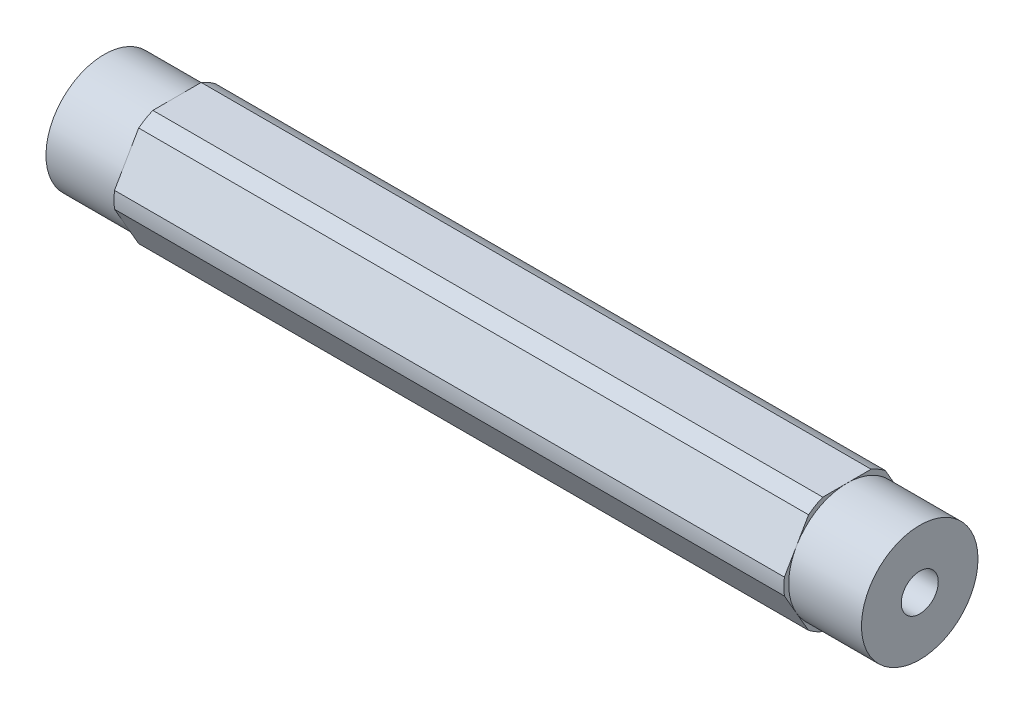
ISO-10303-21;
HEADER;
FILE_DESCRIPTION(('STEP AP214'),'2;1');
FILE_NAME('part.step','',(''),(''),'','','');
FILE_SCHEMA(('AUTOMOTIVE_DESIGN { 1 0 10303 214 1 1 1 1 }'));
ENDSEC;
DATA;
#1=APPLICATION_CONTEXT('core data for automotive mechanical design processes');
#2=APPLICATION_PROTOCOL_DEFINITION('international standard','automotive_design',2000,#1);
#3=PRODUCT_CONTEXT('',#1,'mechanical');
#4=PRODUCT('Part','Part','',(#3));
#5=PRODUCT_RELATED_PRODUCT_CATEGORY('part','',(#4));
#6=PRODUCT_DEFINITION_FORMATION('','',#4);
#7=PRODUCT_DEFINITION_CONTEXT('part definition',#1,'design');
#8=PRODUCT_DEFINITION('design','',#6,#7);
#9=PRODUCT_DEFINITION_SHAPE('','',#8);
#10=(LENGTH_UNIT() NAMED_UNIT(*) SI_UNIT(.MILLI.,.METRE.));
#11=(NAMED_UNIT(*) PLANE_ANGLE_UNIT() SI_UNIT($,.RADIAN.));
#12=(NAMED_UNIT(*) SI_UNIT($,.STERADIAN.) SOLID_ANGLE_UNIT());
#13=UNCERTAINTY_MEASURE_WITH_UNIT(LENGTH_MEASURE(1.E-05),#10,'distance_accuracy_value','');
#14=(GEOMETRIC_REPRESENTATION_CONTEXT(3) GLOBAL_UNCERTAINTY_ASSIGNED_CONTEXT((#13)) GLOBAL_UNIT_ASSIGNED_CONTEXT((#10,
#11,#12)) REPRESENTATION_CONTEXT('',''));
#15=CARTESIAN_POINT('',(0.,0.,0.));
#16=DIRECTION('',(0.,0.,1.));
#17=DIRECTION('',(1.,0.,0.));
#18=AXIS2_PLACEMENT_3D('',#15,#16,#17);
#19=CARTESIAN_POINT('',(-44.45,0.,0.));
#20=DIRECTION('',(1.,0.,0.));
#21=DIRECTION('',(0.,0.,-1.));
#22=AXIS2_PLACEMENT_3D('',#19,#20,#21);
#23=PLANE('',#22);
#24=CARTESIAN_POINT('',(-44.45,0.,0.));
#25=DIRECTION('',(1.,0.,0.));
#26=DIRECTION('',(0.,0.,-1.));
#27=AXIS2_PLACEMENT_3D('',#24,#25,#26);
#28=CIRCLE('',#27,2.0193);
#29=CARTESIAN_POINT('',(-44.45,0.,-2.0193));
#30=VERTEX_POINT('',#29);
#31=EDGE_CURVE('E249',#30,#30,#28,.T.);
#32=ORIENTED_EDGE('',*,*,#31,.T.);
#33=EDGE_LOOP('',(#32));
#34=FACE_BOUND('',#33,.T.);
#35=CARTESIAN_POINT('',(-44.45,0.,0.));
#36=DIRECTION('',(1.,0.,0.));
#37=DIRECTION('',(0.,0.,-1.));
#38=AXIS2_PLACEMENT_3D('',#35,#36,#37);
#39=CIRCLE('',#38,6.35);
#40=CARTESIAN_POINT('',(-44.45,0.,-6.35));
#41=VERTEX_POINT('',#40);
#42=EDGE_CURVE('E59',#41,#41,#39,.F.);
#43=ORIENTED_EDGE('',*,*,#42,.T.);
#44=EDGE_LOOP('',(#43));
#45=FACE_BOUND('',#44,.T.);
#46=ADVANCED_FACE('F51',(#34,#45),#23,.F.);
#47=CARTESIAN_POINT('',(44.45,3.17499999999999,-5.49926131403115));
#48=DIRECTION('',(0.,-0.500000000000001,0.866025403784438));
#49=DIRECTION('',(0.,-0.866025403784438,-0.500000000000001));
#50=AXIS2_PLACEMENT_3D('',#47,#48,#49);
#51=PLANE('',#50);
#52=DIRECTION('',(-1.,0.,0.));
#53=VECTOR('',#52,1.);
#54=CARTESIAN_POINT('',(44.45,0.893039571032097,-6.81675178197584));
#55=LINE('',#54,#53);
#56=CARTESIAN_POINT('',(36.5125,0.893039571032097,-6.81675178197584));
#57=VERTEX_POINT('',#56);
#58=CARTESIAN_POINT('',(-36.5125,0.893039571032097,-6.81675178197584));
#59=VERTEX_POINT('',#58);
#60=EDGE_CURVE('E208',#57,#59,#55,.T.);
#61=ORIENTED_EDGE('',*,*,#60,.T.);
#62=DIRECTION('',(0.,0.866025403784438,0.500000000000001));
#63=VECTOR('',#62,1.);
#64=CARTESIAN_POINT('',(-36.5125,3.17499999999999,-5.49926131403115));
#65=LINE('',#64,#63);
#66=CARTESIAN_POINT('',(-36.5125,3.17500000000001,-5.49926131403118));
#67=VERTEX_POINT('',#66);
#68=EDGE_CURVE('E66',#59,#67,#65,.T.);
#69=ORIENTED_EDGE('',*,*,#68,.T.);
#70=CARTESIAN_POINT('',(-36.5125,5.45696042896788,-4.18177084608646));
#71=VERTEX_POINT('',#70);
#72=EDGE_CURVE('E177',#67,#71,#65,.T.);
#73=ORIENTED_EDGE('',*,*,#72,.T.);
#74=DIRECTION('',(-1.,0.,0.));
#75=VECTOR('',#74,1.);
#76=CARTESIAN_POINT('',(44.45,5.45696042896788,-4.18177084608646));
#77=LINE('',#76,#75);
#78=CARTESIAN_POINT('',(36.5125,5.45696042896788,-4.18177084608646));
#79=VERTEX_POINT('',#78);
#80=EDGE_CURVE('E283',#79,#71,#77,.T.);
#81=ORIENTED_EDGE('',*,*,#80,.F.);
#82=DIRECTION('',(0.,0.866025403784438,0.500000000000001));
#83=VECTOR('',#82,1.);
#84=CARTESIAN_POINT('',(36.5125,3.17499999999999,-5.49926131403115));
#85=LINE('',#84,#83);
#86=CARTESIAN_POINT('',(36.5125,3.17500000000001,-5.49926131403118));
#87=VERTEX_POINT('',#86);
#88=EDGE_CURVE('E243',#87,#79,#85,.T.);
#89=ORIENTED_EDGE('',*,*,#88,.F.);
#90=EDGE_CURVE('E245',#57,#87,#85,.T.);
#91=ORIENTED_EDGE('',*,*,#90,.F.);
#92=EDGE_LOOP('',(#61,#69,#73,#81,#89,#91));
#93=FACE_BOUND('',#92,.T.);
#94=ADVANCED_FACE('F205',(#93),#51,.F.);
#95=CARTESIAN_POINT('',(44.45,0.,0.));
#96=DIRECTION('',(-1.,0.,0.));
#97=DIRECTION('',(0.,0.,1.));
#98=AXIS2_PLACEMENT_3D('',#95,#96,#97);
#99=CYLINDRICAL_SURFACE('',#98,6.874999966);
#100=ORIENTED_EDGE('',*,*,#80,.T.);
#101=CARTESIAN_POINT('',(-36.5125,0.,0.));
#102=DIRECTION('',(1.,0.,0.));
#103=DIRECTION('',(0.,0.,-1.));
#104=AXIS2_PLACEMENT_3D('',#101,#102,#103);
#105=CIRCLE('',#104,6.874999966);
#106=CARTESIAN_POINT('',(-36.5125,6.34999999999997,-2.63498093588935));
#107=VERTEX_POINT('',#106);
#108=EDGE_CURVE('E183',#71,#107,#105,.T.);
#109=ORIENTED_EDGE('',*,*,#108,.T.);
#110=DIRECTION('',(-1.,0.,0.));
#111=VECTOR('',#110,1.);
#112=CARTESIAN_POINT('',(44.45,6.34999999999997,-2.63498093588935));
#113=LINE('',#112,#111);
#114=CARTESIAN_POINT('',(36.5125,6.34999999999997,-2.63498093588935));
#115=VERTEX_POINT('',#114);
#116=EDGE_CURVE('E280',#115,#107,#113,.T.);
#117=ORIENTED_EDGE('',*,*,#116,.F.);
#118=CARTESIAN_POINT('',(36.5125,0.,0.));
#119=DIRECTION('',(1.,0.,0.));
#120=DIRECTION('',(0.,0.,-1.));
#121=AXIS2_PLACEMENT_3D('',#118,#119,#120);
#122=CIRCLE('',#121,6.874999966);
#123=EDGE_CURVE('E241',#79,#115,#122,.T.);
#124=ORIENTED_EDGE('',*,*,#123,.F.);
#125=EDGE_LOOP('',(#100,#109,#117,#124));
#126=FACE_BOUND('',#125,.T.);
#127=ADVANCED_FACE('F307',(#126),#99,.T.);
#128=CARTESIAN_POINT('',(44.45,6.34999999999997,0.));
#129=DIRECTION('',(0.,-1.,0.));
#130=DIRECTION('',(0.,0.,-1.));
#131=AXIS2_PLACEMENT_3D('',#128,#129,#130);
#132=PLANE('',#131);
#133=ORIENTED_EDGE('',*,*,#116,.T.);
#134=DIRECTION('',(0.,0.,1.));
#135=VECTOR('',#134,1.);
#136=CARTESIAN_POINT('',(-36.5125,6.34999999999997,0.));
#137=LINE('',#136,#135);
#138=CARTESIAN_POINT('',(-36.5125,6.35,0.));
#139=VERTEX_POINT('',#138);
#140=EDGE_CURVE('E346',#107,#139,#137,.T.);
#141=ORIENTED_EDGE('',*,*,#140,.T.);
#142=CARTESIAN_POINT('',(-36.5125,6.34999999999996,2.6349809358894));
#143=VERTEX_POINT('',#142);
#144=EDGE_CURVE('E349',#139,#143,#137,.T.);
#145=ORIENTED_EDGE('',*,*,#144,.T.);
#146=DIRECTION('',(-1.,0.,0.));
#147=VECTOR('',#146,1.);
#148=CARTESIAN_POINT('',(44.45,6.34999999999996,2.6349809358894));
#149=LINE('',#148,#147);
#150=CARTESIAN_POINT('',(36.5125,6.34999999999996,2.6349809358894));
#151=VERTEX_POINT('',#150);
#152=EDGE_CURVE('E277',#151,#143,#149,.T.);
#153=ORIENTED_EDGE('',*,*,#152,.F.);
#154=DIRECTION('',(0.,0.,1.));
#155=VECTOR('',#154,1.);
#156=CARTESIAN_POINT('',(36.5125,6.34999999999997,0.));
#157=LINE('',#156,#155);
#158=CARTESIAN_POINT('',(36.5125,6.35,0.));
#159=VERTEX_POINT('',#158);
#160=EDGE_CURVE('E238',#159,#151,#157,.T.);
#161=ORIENTED_EDGE('',*,*,#160,.F.);
#162=EDGE_CURVE('E240',#115,#159,#157,.T.);
#163=ORIENTED_EDGE('',*,*,#162,.F.);
#164=EDGE_LOOP('',(#133,#141,#145,#153,#161,#163));
#165=FACE_BOUND('',#164,.T.);
#166=ADVANCED_FACE('F314',(#165),#132,.F.);
#167=ORIENTED_EDGE('',*,*,#152,.T.);
#168=CARTESIAN_POINT('',(-36.5125,0.,0.));
#169=DIRECTION('',(1.,0.,0.));
#170=DIRECTION('',(0.,0.,-1.));
#171=AXIS2_PLACEMENT_3D('',#168,#169,#170);
#172=CIRCLE('',#171,6.874999966);
#173=CARTESIAN_POINT('',(-36.5125,5.45696042896785,4.1817708460865));
#174=VERTEX_POINT('',#173);
#175=EDGE_CURVE('E350',#143,#174,#172,.T.);
#176=ORIENTED_EDGE('',*,*,#175,.T.);
#177=DIRECTION('',(-1.,0.,0.));
#178=VECTOR('',#177,1.);
#179=CARTESIAN_POINT('',(44.45,5.45696042896785,4.1817708460865));
#180=LINE('',#179,#178);
#181=CARTESIAN_POINT('',(36.5125,5.45696042896785,4.1817708460865));
#182=VERTEX_POINT('',#181);
#183=EDGE_CURVE('E274',#182,#174,#180,.T.);
#184=ORIENTED_EDGE('',*,*,#183,.F.);
#185=CARTESIAN_POINT('',(36.5125,0.,0.));
#186=DIRECTION('',(1.,0.,0.));
#187=DIRECTION('',(0.,0.,-1.));
#188=AXIS2_PLACEMENT_3D('',#185,#186,#187);
#189=CIRCLE('',#188,6.874999966);
#190=EDGE_CURVE('E236',#151,#182,#189,.T.);
#191=ORIENTED_EDGE('',*,*,#190,.F.);
#192=EDGE_LOOP('',(#167,#176,#184,#191));
#193=FACE_BOUND('',#192,.T.);
#194=ADVANCED_FACE('F316',(#193),#99,.T.);
#195=CARTESIAN_POINT('',(44.45,3.17499999999995,5.49926131403117));
#196=DIRECTION('',(0.,-0.499999999999995,-0.866025403784441));
#197=DIRECTION('',(0.,0.866025403784442,-0.499999999999995));
#198=AXIS2_PLACEMENT_3D('',#195,#196,#197);
#199=PLANE('',#198);
#200=ORIENTED_EDGE('',*,*,#183,.T.);
#201=DIRECTION('',(0.,-0.866025403784442,0.499999999999995));
#202=VECTOR('',#201,1.);
#203=CARTESIAN_POINT('',(-36.5125,3.17499999999995,5.49926131403117));
#204=LINE('',#203,#202);
#205=CARTESIAN_POINT('',(-36.5125,3.17499999999997,5.4992613140312));
#206=VERTEX_POINT('',#205);
#207=EDGE_CURVE('E354',#174,#206,#204,.T.);
#208=ORIENTED_EDGE('',*,*,#207,.T.);
#209=CARTESIAN_POINT('',(-36.5125,0.893039571032046,6.81675178197585));
#210=VERTEX_POINT('',#209);
#211=EDGE_CURVE('E355',#206,#210,#204,.T.);
#212=ORIENTED_EDGE('',*,*,#211,.T.);
#213=DIRECTION('',(-1.,0.,0.));
#214=VECTOR('',#213,1.);
#215=CARTESIAN_POINT('',(44.45,0.893039571032046,6.81675178197585));
#216=LINE('',#215,#214);
#217=CARTESIAN_POINT('',(36.5125,0.893039571032046,6.81675178197585));
#218=VERTEX_POINT('',#217);
#219=EDGE_CURVE('E271',#218,#210,#216,.T.);
#220=ORIENTED_EDGE('',*,*,#219,.F.);
#221=DIRECTION('',(0.,-0.866025403784442,0.499999999999995));
#222=VECTOR('',#221,1.);
#223=CARTESIAN_POINT('',(36.5125,3.17499999999995,5.49926131403117));
#224=LINE('',#223,#222);
#225=CARTESIAN_POINT('',(36.5125,3.17499999999997,5.4992613140312));
#226=VERTEX_POINT('',#225);
#227=EDGE_CURVE('E233',#226,#218,#224,.T.);
#228=ORIENTED_EDGE('',*,*,#227,.F.);
#229=EDGE_CURVE('E235',#182,#226,#224,.T.);
#230=ORIENTED_EDGE('',*,*,#229,.F.);
#231=EDGE_LOOP('',(#200,#208,#212,#220,#228,#230));
#232=FACE_BOUND('',#231,.T.);
#233=ADVANCED_FACE('F333',(#232),#199,.F.);
#234=ORIENTED_EDGE('',*,*,#219,.T.);
#235=CARTESIAN_POINT('',(-36.5125,0.,0.));
#236=DIRECTION('',(1.,0.,0.));
#237=DIRECTION('',(0.,0.,-1.));
#238=AXIS2_PLACEMENT_3D('',#235,#236,#237);
#239=CIRCLE('',#238,6.874999966);
#240=CARTESIAN_POINT('',(-36.5125,-0.893039571032144,6.81675178197583));
#241=VERTEX_POINT('',#240);
#242=EDGE_CURVE('E358',#210,#241,#239,.T.);
#243=ORIENTED_EDGE('',*,*,#242,.T.);
#244=DIRECTION('',(-1.,0.,0.));
#245=VECTOR('',#244,1.);
#246=CARTESIAN_POINT('',(44.45,-0.893039571032144,6.81675178197584));
#247=LINE('',#246,#245);
#248=CARTESIAN_POINT('',(36.5125,-0.893039571032144,6.81675178197583));
#249=VERTEX_POINT('',#248);
#250=EDGE_CURVE('E268',#249,#241,#247,.T.);
#251=ORIENTED_EDGE('',*,*,#250,.F.);
#252=CARTESIAN_POINT('',(36.5125,0.,0.));
#253=DIRECTION('',(1.,0.,0.));
#254=DIRECTION('',(0.,0.,-1.));
#255=AXIS2_PLACEMENT_3D('',#252,#253,#254);
#256=CIRCLE('',#255,6.874999966);
#257=EDGE_CURVE('E231',#218,#249,#256,.T.);
#258=ORIENTED_EDGE('',*,*,#257,.F.);
#259=EDGE_LOOP('',(#234,#243,#251,#258));
#260=FACE_BOUND('',#259,.T.);
#261=ADVANCED_FACE('F331',(#260),#99,.T.);
#262=CARTESIAN_POINT('',(44.45,-3.17500000000003,5.49926131403113));
#263=DIRECTION('',(0.,0.500000000000007,-0.866025403784434));
#264=DIRECTION('',(0.,0.866025403784435,0.500000000000007));
#265=AXIS2_PLACEMENT_3D('',#262,#263,#264);
#266=PLANE('',#265);
#267=ORIENTED_EDGE('',*,*,#250,.T.);
#268=DIRECTION('',(0.,-0.866025403784435,-0.500000000000007));
#269=VECTOR('',#268,1.);
#270=CARTESIAN_POINT('',(-36.5125,-3.17500000000003,5.49926131403113));
#271=LINE('',#270,#269);
#272=CARTESIAN_POINT('',(-36.5125,-3.17500000000004,5.49926131403116));
#273=VERTEX_POINT('',#272);
#274=EDGE_CURVE('E361',#241,#273,#271,.T.);
#275=ORIENTED_EDGE('',*,*,#274,.T.);
#276=CARTESIAN_POINT('',(-36.5125,-5.45696042896791,4.18177084608642));
#277=VERTEX_POINT('',#276);
#278=EDGE_CURVE('E362',#273,#277,#271,.T.);
#279=ORIENTED_EDGE('',*,*,#278,.T.);
#280=DIRECTION('',(-1.,0.,0.));
#281=VECTOR('',#280,1.);
#282=CARTESIAN_POINT('',(44.45,-5.45696042896791,4.18177084608642));
#283=LINE('',#282,#281);
#284=CARTESIAN_POINT('',(36.5125,-5.45696042896791,4.18177084608642));
#285=VERTEX_POINT('',#284);
#286=EDGE_CURVE('E265',#285,#277,#283,.T.);
#287=ORIENTED_EDGE('',*,*,#286,.F.);
#288=DIRECTION('',(0.,-0.866025403784435,-0.500000000000007));
#289=VECTOR('',#288,1.);
#290=CARTESIAN_POINT('',(36.5125,-3.17500000000003,5.49926131403113));
#291=LINE('',#290,#289);
#292=CARTESIAN_POINT('',(36.5125,-3.17500000000004,5.49926131403116));
#293=VERTEX_POINT('',#292);
#294=EDGE_CURVE('E228',#293,#285,#291,.T.);
#295=ORIENTED_EDGE('',*,*,#294,.F.);
#296=EDGE_CURVE('E230',#249,#293,#291,.T.);
#297=ORIENTED_EDGE('',*,*,#296,.F.);
#298=EDGE_LOOP('',(#267,#275,#279,#287,#295,#297));
#299=FACE_BOUND('',#298,.T.);
#300=ADVANCED_FACE('F328',(#299),#266,.F.);
#301=ORIENTED_EDGE('',*,*,#286,.T.);
#302=CARTESIAN_POINT('',(-36.5125,0.,0.));
#303=DIRECTION('',(1.,0.,0.));
#304=DIRECTION('',(0.,0.,-1.));
#305=AXIS2_PLACEMENT_3D('',#302,#303,#304);
#306=CIRCLE('',#305,6.874999966);
#307=CARTESIAN_POINT('',(-36.5125,-6.34999999999999,2.63498093588931));
#308=VERTEX_POINT('',#307);
#309=EDGE_CURVE('E365',#277,#308,#306,.T.);
#310=ORIENTED_EDGE('',*,*,#309,.T.);
#311=DIRECTION('',(-1.,0.,0.));
#312=VECTOR('',#311,1.);
#313=CARTESIAN_POINT('',(44.45,-6.34999999999999,2.63498093588931));
#314=LINE('',#313,#312);
#315=CARTESIAN_POINT('',(36.5125,-6.34999999999999,2.63498093588931));
#316=VERTEX_POINT('',#315);
#317=EDGE_CURVE('E262',#316,#308,#314,.T.);
#318=ORIENTED_EDGE('',*,*,#317,.F.);
#319=CARTESIAN_POINT('',(36.5125,0.,0.));
#320=DIRECTION('',(1.,0.,0.));
#321=DIRECTION('',(0.,0.,-1.));
#322=AXIS2_PLACEMENT_3D('',#319,#320,#321);
#323=CIRCLE('',#322,6.874999966);
#324=EDGE_CURVE('E226',#285,#316,#323,.T.);
#325=ORIENTED_EDGE('',*,*,#324,.F.);
#326=EDGE_LOOP('',(#301,#310,#318,#325));
#327=FACE_BOUND('',#326,.T.);
#328=ADVANCED_FACE('F326',(#327),#99,.T.);
#329=CARTESIAN_POINT('',(44.45,-6.34999999999996,0.));
#330=DIRECTION('',(0.,1.,0.));
#331=DIRECTION('',(0.,0.,1.));
#332=AXIS2_PLACEMENT_3D('',#329,#330,#331);
#333=PLANE('',#332);
#334=ORIENTED_EDGE('',*,*,#317,.T.);
#335=DIRECTION('',(0.,0.,-1.));
#336=VECTOR('',#335,1.);
#337=CARTESIAN_POINT('',(-36.5125,-6.34999999999996,0.));
#338=LINE('',#337,#336);
#339=CARTESIAN_POINT('',(-36.5125,-6.35,0.));
#340=VERTEX_POINT('',#339);
#341=EDGE_CURVE('E368',#308,#340,#338,.T.);
#342=ORIENTED_EDGE('',*,*,#341,.T.);
#343=CARTESIAN_POINT('',(-36.5125,-6.34999999999994,-2.63498093588944));
#344=VERTEX_POINT('',#343);
#345=EDGE_CURVE('E369',#340,#344,#338,.T.);
#346=ORIENTED_EDGE('',*,*,#345,.T.);
#347=DIRECTION('',(-1.,0.,0.));
#348=VECTOR('',#347,1.);
#349=CARTESIAN_POINT('',(44.45,-6.34999999999994,-2.63498093588944));
#350=LINE('',#349,#348);
#351=CARTESIAN_POINT('',(36.5125,-6.34999999999994,-2.63498093588944));
#352=VERTEX_POINT('',#351);
#353=EDGE_CURVE('E259',#352,#344,#350,.T.);
#354=ORIENTED_EDGE('',*,*,#353,.F.);
#355=DIRECTION('',(0.,0.,-1.));
#356=VECTOR('',#355,1.);
#357=CARTESIAN_POINT('',(36.5125,-6.34999999999996,0.));
#358=LINE('',#357,#356);
#359=CARTESIAN_POINT('',(36.5125,-6.35,0.));
#360=VERTEX_POINT('',#359);
#361=EDGE_CURVE('E223',#360,#352,#358,.T.);
#362=ORIENTED_EDGE('',*,*,#361,.F.);
#363=EDGE_CURVE('E225',#316,#360,#358,.T.);
#364=ORIENTED_EDGE('',*,*,#363,.F.);
#365=EDGE_LOOP('',(#334,#342,#346,#354,#362,#364));
#366=FACE_BOUND('',#365,.T.);
#367=ADVANCED_FACE('F323',(#366),#333,.F.);
#368=ORIENTED_EDGE('',*,*,#353,.T.);
#369=CARTESIAN_POINT('',(-36.5125,0.,0.));
#370=DIRECTION('',(1.,0.,0.));
#371=DIRECTION('',(0.,0.,-1.));
#372=AXIS2_PLACEMENT_3D('',#369,#370,#371);
#373=CIRCLE('',#372,6.874999966);
#374=CARTESIAN_POINT('',(-36.5125,-5.45696042896781,-4.18177084608655));
#375=VERTEX_POINT('',#374);
#376=EDGE_CURVE('E372',#344,#375,#373,.T.);
#377=ORIENTED_EDGE('',*,*,#376,.T.);
#378=DIRECTION('',(-1.,0.,0.));
#379=VECTOR('',#378,1.);
#380=CARTESIAN_POINT('',(44.45,-5.45696042896782,-4.18177084608655));
#381=LINE('',#380,#379);
#382=CARTESIAN_POINT('',(36.5125,-5.45696042896781,-4.18177084608655));
#383=VERTEX_POINT('',#382);
#384=EDGE_CURVE('E256',#383,#375,#381,.T.);
#385=ORIENTED_EDGE('',*,*,#384,.F.);
#386=CARTESIAN_POINT('',(36.5125,0.,0.));
#387=DIRECTION('',(1.,0.,0.));
#388=DIRECTION('',(0.,0.,-1.));
#389=AXIS2_PLACEMENT_3D('',#386,#387,#388);
#390=CIRCLE('',#389,6.874999966);
#391=EDGE_CURVE('E221',#352,#383,#390,.T.);
#392=ORIENTED_EDGE('',*,*,#391,.F.);
#393=EDGE_LOOP('',(#368,#377,#385,#392));
#394=FACE_BOUND('',#393,.T.);
#395=ADVANCED_FACE('F321',(#394),#99,.T.);
#396=CARTESIAN_POINT('',(44.45,-3.17499999999996,-5.49926131403119));
#397=DIRECTION('',(0.,0.499999999999995,0.866025403784441));
#398=DIRECTION('',(0.,-0.866025403784441,0.499999999999995));
#399=AXIS2_PLACEMENT_3D('',#396,#397,#398);
#400=PLANE('',#399);
#401=ORIENTED_EDGE('',*,*,#384,.T.);
#402=DIRECTION('',(0.,0.866025403784441,-0.499999999999995));
#403=VECTOR('',#402,1.);
#404=CARTESIAN_POINT('',(-36.5125,-3.17499999999996,-5.49926131403119));
#405=LINE('',#404,#403);
#406=CARTESIAN_POINT('',(-36.5125,-3.17499999999997,-5.4992613140312));
#407=VERTEX_POINT('',#406);
#408=EDGE_CURVE('E375',#375,#407,#405,.T.);
#409=ORIENTED_EDGE('',*,*,#408,.T.);
#410=CARTESIAN_POINT('',(-36.5125,-0.893039571032112,-6.81675178197584));
#411=VERTEX_POINT('',#410);
#412=EDGE_CURVE('E192',#407,#411,#405,.T.);
#413=ORIENTED_EDGE('',*,*,#412,.T.);
#414=DIRECTION('',(-1.,0.,0.));
#415=VECTOR('',#414,1.);
#416=CARTESIAN_POINT('',(44.45,-0.893039571032111,-6.81675178197584));
#417=LINE('',#416,#415);
#418=CARTESIAN_POINT('',(36.5125,-0.893039571032111,-6.81675178197584));
#419=VERTEX_POINT('',#418);
#420=EDGE_CURVE('E253',#419,#411,#417,.T.);
#421=ORIENTED_EDGE('',*,*,#420,.F.);
#422=DIRECTION('',(0.,0.866025403784441,-0.499999999999995));
#423=VECTOR('',#422,1.);
#424=CARTESIAN_POINT('',(36.5125,-3.17499999999996,-5.49926131403119));
#425=LINE('',#424,#423);
#426=CARTESIAN_POINT('',(36.5125,-3.17499999999997,-5.4992613140312));
#427=VERTEX_POINT('',#426);
#428=EDGE_CURVE('E73',#427,#419,#425,.T.);
#429=ORIENTED_EDGE('',*,*,#428,.F.);
#430=EDGE_CURVE('E220',#383,#427,#425,.T.);
#431=ORIENTED_EDGE('',*,*,#430,.F.);
#432=EDGE_LOOP('',(#401,#409,#413,#421,#429,#431));
#433=FACE_BOUND('',#432,.T.);
#434=ADVANCED_FACE('F318',(#433),#400,.F.);
#435=ORIENTED_EDGE('',*,*,#420,.T.);
#436=CARTESIAN_POINT('',(-36.5125,0.,0.));
#437=DIRECTION('',(1.,0.,0.));
#438=DIRECTION('',(0.,0.,-1.));
#439=AXIS2_PLACEMENT_3D('',#436,#437,#438);
#440=CIRCLE('',#439,6.874999966);
#441=EDGE_CURVE('E12',#411,#59,#440,.T.);
#442=ORIENTED_EDGE('',*,*,#441,.T.);
#443=ORIENTED_EDGE('',*,*,#60,.F.);
#444=CARTESIAN_POINT('',(36.5125,0.,0.));
#445=DIRECTION('',(1.,0.,0.));
#446=DIRECTION('',(0.,0.,-1.));
#447=AXIS2_PLACEMENT_3D('',#444,#445,#446);
#448=CIRCLE('',#447,6.874999966);
#449=EDGE_CURVE('E288',#419,#57,#448,.T.);
#450=ORIENTED_EDGE('',*,*,#449,.F.);
#451=EDGE_LOOP('',(#435,#442,#443,#450));
#452=FACE_BOUND('',#451,.T.);
#453=ADVANCED_FACE('F317',(#452),#99,.T.);
#454=CARTESIAN_POINT('',(44.45,0.,0.));
#455=DIRECTION('',(1.,0.,0.));
#456=DIRECTION('',(0.,0.,-1.));
#457=AXIS2_PLACEMENT_3D('',#454,#455,#456);
#458=PLANE('',#457);
#459=CARTESIAN_POINT('',(44.45,0.,0.));
#460=DIRECTION('',(1.,0.,0.));
#461=DIRECTION('',(0.,0.,-1.));
#462=AXIS2_PLACEMENT_3D('',#459,#460,#461);
#463=CIRCLE('',#462,2.0193);
#464=CARTESIAN_POINT('',(44.45,0.,-2.0193));
#465=VERTEX_POINT('',#464);
#466=EDGE_CURVE('E246',#465,#465,#463,.T.);
#467=ORIENTED_EDGE('',*,*,#466,.F.);
#468=EDGE_LOOP('',(#467));
#469=FACE_BOUND('',#468,.T.);
#470=CARTESIAN_POINT('',(44.45,0.,0.));
#471=DIRECTION('',(1.,0.,0.));
#472=DIRECTION('',(0.,0.,-1.));
#473=AXIS2_PLACEMENT_3D('',#470,#471,#472);
#474=CIRCLE('',#473,6.35);
#475=CARTESIAN_POINT('',(44.45,0.,-6.35));
#476=VERTEX_POINT('',#475);
#477=EDGE_CURVE('E285',#476,#476,#474,.T.);
#478=ORIENTED_EDGE('',*,*,#477,.T.);
#479=EDGE_LOOP('',(#478));
#480=FACE_BOUND('',#479,.T.);
#481=ADVANCED_FACE('F310',(#469,#480),#458,.T.);
#482=CARTESIAN_POINT('',(44.45,0.,0.));
#483=DIRECTION('',(-1.,0.,0.));
#484=DIRECTION('',(0.,0.,1.));
#485=AXIS2_PLACEMENT_3D('',#482,#483,#484);
#486=CYLINDRICAL_SURFACE('',#485,2.0193);
#487=ORIENTED_EDGE('',*,*,#466,.T.);
#488=EDGE_LOOP('',(#487));
#489=FACE_BOUND('',#488,.T.);
#490=ORIENTED_EDGE('',*,*,#31,.F.);
#491=EDGE_LOOP('',(#490));
#492=FACE_BOUND('',#491,.T.);
#493=ADVANCED_FACE('F53',(#489,#492),#486,.F.);
#494=CARTESIAN_POINT('',(36.5125,0.,0.));
#495=DIRECTION('',(1.,0.,0.));
#496=DIRECTION('',(0.,0.,-1.));
#497=AXIS2_PLACEMENT_3D('',#494,#495,#496);
#498=PLANE('',#497);
#499=ORIENTED_EDGE('',*,*,#90,.T.);
#500=CARTESIAN_POINT('',(36.5125,0.,0.));
#501=DIRECTION('',(1.,0.,0.));
#502=DIRECTION('',(0.,0.,-1.));
#503=AXIS2_PLACEMENT_3D('',#500,#501,#502);
#504=CIRCLE('',#503,6.35);
#505=EDGE_CURVE('E209',#427,#87,#504,.T.);
#506=ORIENTED_EDGE('',*,*,#505,.F.);
#507=ORIENTED_EDGE('',*,*,#428,.T.);
#508=ORIENTED_EDGE('',*,*,#449,.T.);
#509=EDGE_LOOP('',(#499,#506,#507,#508));
#510=FACE_BOUND('',#509,.T.);
#511=ADVANCED_FACE('F422',(#510),#498,.T.);
#512=ORIENTED_EDGE('',*,*,#88,.T.);
#513=ORIENTED_EDGE('',*,*,#123,.T.);
#514=ORIENTED_EDGE('',*,*,#162,.T.);
#515=EDGE_CURVE('E213',#87,#159,#504,.T.);
#516=ORIENTED_EDGE('',*,*,#515,.F.);
#517=EDGE_LOOP('',(#512,#513,#514,#516));
#518=FACE_BOUND('',#517,.T.);
#519=ADVANCED_FACE('F416',(#518),#498,.T.);
#520=ORIENTED_EDGE('',*,*,#160,.T.);
#521=ORIENTED_EDGE('',*,*,#190,.T.);
#522=ORIENTED_EDGE('',*,*,#229,.T.);
#523=EDGE_CURVE('E218',#159,#226,#504,.T.);
#524=ORIENTED_EDGE('',*,*,#523,.F.);
#525=EDGE_LOOP('',(#520,#521,#522,#524));
#526=FACE_BOUND('',#525,.T.);
#527=ADVANCED_FACE('F405',(#526),#498,.T.);
#528=ORIENTED_EDGE('',*,*,#227,.T.);
#529=ORIENTED_EDGE('',*,*,#257,.T.);
#530=ORIENTED_EDGE('',*,*,#296,.T.);
#531=EDGE_CURVE('E410',#226,#293,#504,.T.);
#532=ORIENTED_EDGE('',*,*,#531,.F.);
#533=EDGE_LOOP('',(#528,#529,#530,#532));
#534=FACE_BOUND('',#533,.T.);
#535=ADVANCED_FACE('F438',(#534),#498,.T.);
#536=ORIENTED_EDGE('',*,*,#294,.T.);
#537=ORIENTED_EDGE('',*,*,#324,.T.);
#538=ORIENTED_EDGE('',*,*,#363,.T.);
#539=EDGE_CURVE('E424',#293,#360,#504,.T.);
#540=ORIENTED_EDGE('',*,*,#539,.F.);
#541=EDGE_LOOP('',(#536,#537,#538,#540));
#542=FACE_BOUND('',#541,.T.);
#543=ADVANCED_FACE('F432',(#542),#498,.T.);
#544=ORIENTED_EDGE('',*,*,#361,.T.);
#545=ORIENTED_EDGE('',*,*,#391,.T.);
#546=ORIENTED_EDGE('',*,*,#430,.T.);
#547=EDGE_CURVE('E211',#360,#427,#504,.T.);
#548=ORIENTED_EDGE('',*,*,#547,.F.);
#549=EDGE_LOOP('',(#544,#545,#546,#548));
#550=FACE_BOUND('',#549,.T.);
#551=ADVANCED_FACE('F420',(#550),#498,.T.);
#552=CARTESIAN_POINT('',(36.5125,0.,0.));
#553=DIRECTION('',(1.,0.,0.));
#554=DIRECTION('',(0.,0.,-1.));
#555=AXIS2_PLACEMENT_3D('',#552,#553,#554);
#556=CYLINDRICAL_SURFACE('',#555,6.35);
#557=ORIENTED_EDGE('',*,*,#477,.F.);
#558=EDGE_LOOP('',(#557));
#559=FACE_BOUND('',#558,.T.);
#560=ORIENTED_EDGE('',*,*,#505,.T.);
#561=ORIENTED_EDGE('',*,*,#515,.T.);
#562=ORIENTED_EDGE('',*,*,#523,.T.);
#563=ORIENTED_EDGE('',*,*,#531,.T.);
#564=ORIENTED_EDGE('',*,*,#539,.T.);
#565=ORIENTED_EDGE('',*,*,#547,.T.);
#566=EDGE_LOOP('',(#560,#561,#562,#563,#564,#565));
#567=FACE_BOUND('',#566,.T.);
#568=ADVANCED_FACE('F412',(#559,#567),#556,.T.);
#569=CARTESIAN_POINT('',(-36.5125,0.,0.));
#570=DIRECTION('',(1.,0.,0.));
#571=DIRECTION('',(0.,0.,-1.));
#572=AXIS2_PLACEMENT_3D('',#569,#570,#571);
#573=PLANE('',#572);
#574=ORIENTED_EDGE('',*,*,#441,.F.);
#575=ORIENTED_EDGE('',*,*,#412,.F.);
#576=CARTESIAN_POINT('',(-36.5125,0.,0.));
#577=DIRECTION('',(1.,0.,0.));
#578=DIRECTION('',(0.,0.,-1.));
#579=AXIS2_PLACEMENT_3D('',#576,#577,#578);
#580=CIRCLE('',#579,6.35);
#581=EDGE_CURVE('E189',#407,#67,#580,.T.);
#582=ORIENTED_EDGE('',*,*,#581,.T.);
#583=ORIENTED_EDGE('',*,*,#68,.F.);
#584=EDGE_LOOP('',(#574,#575,#582,#583));
#585=FACE_BOUND('',#584,.T.);
#586=ADVANCED_FACE('F190',(#585),#573,.F.);
#587=EDGE_CURVE('E180',#67,#139,#580,.T.);
#588=ORIENTED_EDGE('',*,*,#587,.T.);
#589=ORIENTED_EDGE('',*,*,#140,.F.);
#590=ORIENTED_EDGE('',*,*,#108,.F.);
#591=ORIENTED_EDGE('',*,*,#72,.F.);
#592=EDGE_LOOP('',(#588,#589,#590,#591));
#593=FACE_BOUND('',#592,.T.);
#594=ADVANCED_FACE('F178',(#593),#573,.F.);
#595=EDGE_CURVE('E203',#139,#206,#580,.T.);
#596=ORIENTED_EDGE('',*,*,#595,.T.);
#597=ORIENTED_EDGE('',*,*,#207,.F.);
#598=ORIENTED_EDGE('',*,*,#175,.F.);
#599=ORIENTED_EDGE('',*,*,#144,.F.);
#600=EDGE_LOOP('',(#596,#597,#598,#599));
#601=FACE_BOUND('',#600,.T.);
#602=ADVANCED_FACE('F396',(#601),#573,.F.);
#603=EDGE_CURVE('E391',#206,#273,#580,.T.);
#604=ORIENTED_EDGE('',*,*,#603,.T.);
#605=ORIENTED_EDGE('',*,*,#274,.F.);
#606=ORIENTED_EDGE('',*,*,#242,.F.);
#607=ORIENTED_EDGE('',*,*,#211,.F.);
#608=EDGE_LOOP('',(#604,#605,#606,#607));
#609=FACE_BOUND('',#608,.T.);
#610=ADVANCED_FACE('F435',(#609),#573,.F.);
#611=EDGE_CURVE('E388',#273,#340,#580,.T.);
#612=ORIENTED_EDGE('',*,*,#611,.T.);
#613=ORIENTED_EDGE('',*,*,#341,.F.);
#614=ORIENTED_EDGE('',*,*,#309,.F.);
#615=ORIENTED_EDGE('',*,*,#278,.F.);
#616=EDGE_LOOP('',(#612,#613,#614,#615));
#617=FACE_BOUND('',#616,.T.);
#618=ADVANCED_FACE('F298',(#617),#573,.F.);
#619=EDGE_CURVE('E196',#340,#407,#580,.T.);
#620=ORIENTED_EDGE('',*,*,#619,.T.);
#621=ORIENTED_EDGE('',*,*,#408,.F.);
#622=ORIENTED_EDGE('',*,*,#376,.F.);
#623=ORIENTED_EDGE('',*,*,#345,.F.);
#624=EDGE_LOOP('',(#620,#621,#622,#623));
#625=FACE_BOUND('',#624,.T.);
#626=ADVANCED_FACE('F293',(#625),#573,.F.);
#627=CARTESIAN_POINT('',(-36.5125,0.,0.));
#628=DIRECTION('',(-1.,0.,0.));
#629=DIRECTION('',(0.,0.,1.));
#630=AXIS2_PLACEMENT_3D('',#627,#628,#629);
#631=CYLINDRICAL_SURFACE('',#630,6.35);
#632=ORIENTED_EDGE('',*,*,#587,.F.);
#633=ORIENTED_EDGE('',*,*,#581,.F.);
#634=ORIENTED_EDGE('',*,*,#619,.F.);
#635=ORIENTED_EDGE('',*,*,#611,.F.);
#636=ORIENTED_EDGE('',*,*,#603,.F.);
#637=ORIENTED_EDGE('',*,*,#595,.F.);
#638=EDGE_LOOP('',(#632,#633,#634,#635,#636,#637));
#639=FACE_BOUND('',#638,.T.);
#640=ORIENTED_EDGE('',*,*,#42,.F.);
#641=EDGE_LOOP('',(#640));
#642=FACE_BOUND('',#641,.T.);
#643=ADVANCED_FACE('F199',(#639,#642),#631,.T.);
#644=CLOSED_SHELL('',(#46,#94,#127,#166,#194,#233,#261,#300,#328,#367,#395,#434,#453,#481,#493,
#511,#519,#527,#535,#543,#551,#568,#586,#594,#602,#610,#618,#626,#643));
#645=MANIFOLD_SOLID_BREP('B2',#644);
#646=ADVANCED_BREP_SHAPE_REPRESENTATION('',(#18,#645),#14);
#647=SHAPE_DEFINITION_REPRESENTATION(#9,#646);
ENDSEC;
END-ISO-10303-21;
